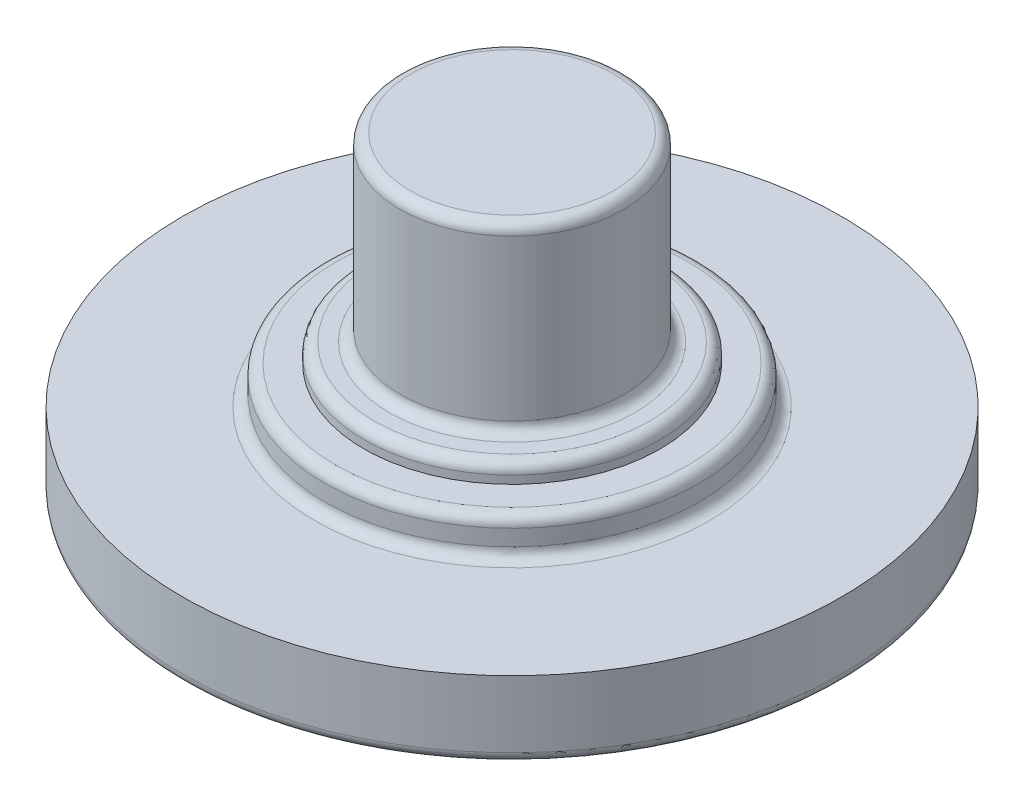
ISO-10303-21;
HEADER;
FILE_DESCRIPTION(('STEP AP214'),'2;1');
FILE_NAME('part.step','',(''),(''),'','','');
FILE_SCHEMA(('AUTOMOTIVE_DESIGN { 1 0 10303 214 1 1 1 1 }'));
ENDSEC;
DATA;
#1=APPLICATION_CONTEXT('core data for automotive mechanical design processes');
#2=APPLICATION_PROTOCOL_DEFINITION('international standard','automotive_design',2000,#1);
#3=PRODUCT_CONTEXT('',#1,'mechanical');
#4=PRODUCT('Part','Part','',(#3));
#5=PRODUCT_RELATED_PRODUCT_CATEGORY('part','',(#4));
#6=PRODUCT_DEFINITION_FORMATION('','',#4);
#7=PRODUCT_DEFINITION_CONTEXT('part definition',#1,'design');
#8=PRODUCT_DEFINITION('design','',#6,#7);
#9=PRODUCT_DEFINITION_SHAPE('','',#8);
#10=(LENGTH_UNIT() NAMED_UNIT(*) SI_UNIT(.MILLI.,.METRE.));
#11=(NAMED_UNIT(*) PLANE_ANGLE_UNIT() SI_UNIT($,.RADIAN.));
#12=(NAMED_UNIT(*) SI_UNIT($,.STERADIAN.) SOLID_ANGLE_UNIT());
#13=UNCERTAINTY_MEASURE_WITH_UNIT(LENGTH_MEASURE(1.E-05),#10,'distance_accuracy_value','');
#14=(GEOMETRIC_REPRESENTATION_CONTEXT(3) GLOBAL_UNCERTAINTY_ASSIGNED_CONTEXT((#13)) GLOBAL_UNIT_ASSIGNED_CONTEXT((#10,
#11,#12)) REPRESENTATION_CONTEXT('',''));
#15=CARTESIAN_POINT('',(0.,0.,0.));
#16=DIRECTION('',(0.,0.,1.));
#17=DIRECTION('',(1.,0.,0.));
#18=AXIS2_PLACEMENT_3D('',#15,#16,#17);
#19=CARTESIAN_POINT('',(0.,52.9542823974938,0.));
#20=DIRECTION('',(0.,-1.,0.));
#21=DIRECTION('',(1.,0.,0.));
#22=AXIS2_PLACEMENT_3D('',#19,#20,#21);
#23=PLANE('',#22);
#24=CARTESIAN_POINT('',(0.,52.9542823974938,0.));
#25=DIRECTION('',(0.,-1.,0.));
#26=DIRECTION('',(1.,0.,0.));
#27=AXIS2_PLACEMENT_3D('',#24,#25,#26);
#28=CIRCLE('',#27,19.);
#29=CARTESIAN_POINT('',(19.,52.9542823974938,0.));
#30=VERTEX_POINT('',#29);
#31=EDGE_CURVE('E102',#30,#30,#28,.F.);
#32=ORIENTED_EDGE('',*,*,#31,.T.);
#33=EDGE_LOOP('',(#32));
#34=FACE_BOUND('',#33,.T.);
#35=ADVANCED_FACE('F31',(#34),#23,.F.);
#36=CARTESIAN_POINT('',(0.,52.9542823974938,0.));
#37=DIRECTION('',(0.,1.,0.));
#38=DIRECTION('',(-1.,0.,0.));
#39=AXIS2_PLACEMENT_3D('',#36,#37,#38);
#40=CYLINDRICAL_SURFACE('',#39,21.);
#41=CARTESIAN_POINT('',(0.,20.9542823974938,0.));
#42=DIRECTION('',(0.,-1.,0.));
#43=DIRECTION('',(1.,0.,0.));
#44=AXIS2_PLACEMENT_3D('',#41,#42,#43);
#45=CIRCLE('',#44,21.);
#46=CARTESIAN_POINT('',(21.,20.9542823974938,0.));
#47=VERTEX_POINT('',#46);
#48=EDGE_CURVE('E87',#47,#47,#45,.F.);
#49=ORIENTED_EDGE('',*,*,#48,.T.);
#50=EDGE_LOOP('',(#49));
#51=FACE_BOUND('',#50,.T.);
#52=CARTESIAN_POINT('',(0.,50.9542823974938,0.));
#53=DIRECTION('',(0.,-1.,0.));
#54=DIRECTION('',(1.,0.,0.));
#55=AXIS2_PLACEMENT_3D('',#52,#53,#54);
#56=CIRCLE('',#55,21.);
#57=CARTESIAN_POINT('',(21.,50.9542823974938,0.));
#58=VERTEX_POINT('',#57);
#59=EDGE_CURVE('E99',#58,#58,#56,.T.);
#60=ORIENTED_EDGE('',*,*,#59,.T.);
#61=EDGE_LOOP('',(#60));
#62=FACE_BOUND('',#61,.T.);
#63=ADVANCED_FACE('F136',(#51,#62),#40,.T.);
#64=CARTESIAN_POINT('',(21.,18.9542823974938,0.));
#65=DIRECTION('',(0.,-1.,0.));
#66=DIRECTION('',(1.,0.,0.));
#67=AXIS2_PLACEMENT_3D('',#64,#65,#66);
#68=PLANE('',#67);
#69=CARTESIAN_POINT('',(0.,18.9542823974938,0.));
#70=DIRECTION('',(0.,-1.,0.));
#71=DIRECTION('',(1.,0.,0.));
#72=AXIS2_PLACEMENT_3D('',#69,#70,#71);
#73=CIRCLE('',#72,25.75);
#74=CARTESIAN_POINT('',(25.75,18.9542823974938,0.));
#75=VERTEX_POINT('',#74);
#76=EDGE_CURVE('E93',#75,#75,#73,.F.);
#77=ORIENTED_EDGE('',*,*,#76,.T.);
#78=EDGE_LOOP('',(#77));
#79=FACE_BOUND('',#78,.T.);
#80=CARTESIAN_POINT('',(0.,18.9542823974938,0.));
#81=DIRECTION('',(0.,-1.,0.));
#82=DIRECTION('',(1.,0.,0.));
#83=AXIS2_PLACEMENT_3D('',#80,#81,#82);
#84=CIRCLE('',#83,23.);
#85=CARTESIAN_POINT('',(23.,18.9542823974938,0.));
#86=VERTEX_POINT('',#85);
#87=EDGE_CURVE('E96',#86,#86,#84,.T.);
#88=ORIENTED_EDGE('',*,*,#87,.T.);
#89=EDGE_LOOP('',(#88));
#90=FACE_BOUND('',#89,.T.);
#91=ADVANCED_FACE('F142',(#79,#90),#68,.F.);
#92=CARTESIAN_POINT('',(0.,52.9542823974938,0.));
#93=DIRECTION('',(0.,1.,0.));
#94=DIRECTION('',(-1.,0.,0.));
#95=AXIS2_PLACEMENT_3D('',#92,#93,#94);
#96=CYLINDRICAL_SURFACE('',#95,27.75);
#97=CARTESIAN_POINT('',(0.,16.9542823974938,0.));
#98=DIRECTION('',(0.,-1.,0.));
#99=DIRECTION('',(1.,0.,0.));
#100=AXIS2_PLACEMENT_3D('',#97,#98,#99);
#101=CIRCLE('',#100,27.75);
#102=CARTESIAN_POINT('',(27.75,16.9542823974938,0.));
#103=VERTEX_POINT('',#102);
#104=EDGE_CURVE('E90',#103,#103,#101,.T.);
#105=ORIENTED_EDGE('',*,*,#104,.T.);
#106=EDGE_LOOP('',(#105));
#107=FACE_BOUND('',#106,.T.);
#108=CARTESIAN_POINT('',(0.,15.4542823974938,0.));
#109=DIRECTION('',(0.,1.,0.));
#110=DIRECTION('',(-1.,0.,0.));
#111=AXIS2_PLACEMENT_3D('',#108,#109,#110);
#112=CIRCLE('',#111,27.75);
#113=CARTESIAN_POINT('',(-27.75,15.4542823974938,0.));
#114=VERTEX_POINT('',#113);
#115=EDGE_CURVE('E105',#114,#114,#112,.T.);
#116=ORIENTED_EDGE('',*,*,#115,.T.);
#117=EDGE_LOOP('',(#116));
#118=FACE_BOUND('',#117,.T.);
#119=ADVANCED_FACE('F226',(#107,#118),#96,.T.);
#120=CARTESIAN_POINT('',(27.75,15.4542823974938,0.));
#121=DIRECTION('',(0.,-1.,0.));
#122=DIRECTION('',(1.,0.,0.));
#123=AXIS2_PLACEMENT_3D('',#120,#121,#122);
#124=PLANE('',#123);
#125=CARTESIAN_POINT('',(0.,15.4542823974938,0.));
#126=DIRECTION('',(0.,-1.,0.));
#127=DIRECTION('',(1.,0.,0.));
#128=AXIS2_PLACEMENT_3D('',#125,#126,#127);
#129=CIRCLE('',#128,33.);
#130=CARTESIAN_POINT('',(33.,15.4542823974938,0.));
#131=VERTEX_POINT('',#130);
#132=EDGE_CURVE('E69',#131,#131,#129,.F.);
#133=ORIENTED_EDGE('',*,*,#132,.T.);
#134=EDGE_LOOP('',(#133));
#135=FACE_BOUND('',#134,.T.);
#136=ORIENTED_EDGE('',*,*,#115,.F.);
#137=EDGE_LOOP('',(#136));
#138=FACE_BOUND('',#137,.T.);
#139=ADVANCED_FACE('F222',(#135,#138),#124,.F.);
#140=CARTESIAN_POINT('',(0.,52.9542823974938,0.));
#141=DIRECTION('',(0.,1.,0.));
#142=DIRECTION('',(-1.,0.,0.));
#143=AXIS2_PLACEMENT_3D('',#140,#141,#142);
#144=CYLINDRICAL_SURFACE('',#143,35.);
#145=CARTESIAN_POINT('',(0.,10.4542823974938,0.));
#146=DIRECTION('',(0.,-1.,0.));
#147=DIRECTION('',(1.,0.,0.));
#148=AXIS2_PLACEMENT_3D('',#145,#146,#147);
#149=CIRCLE('',#148,35.);
#150=CARTESIAN_POINT('',(35.,10.4542823974938,0.));
#151=VERTEX_POINT('',#150);
#152=EDGE_CURVE('E75',#151,#151,#149,.F.);
#153=ORIENTED_EDGE('',*,*,#152,.T.);
#154=EDGE_LOOP('',(#153));
#155=FACE_BOUND('',#154,.T.);
#156=CARTESIAN_POINT('',(0.,13.4542823974938,0.));
#157=DIRECTION('',(0.,-1.,0.));
#158=DIRECTION('',(1.,0.,0.));
#159=AXIS2_PLACEMENT_3D('',#156,#157,#158);
#160=CIRCLE('',#159,35.);
#161=CARTESIAN_POINT('',(35.,13.4542823974938,0.));
#162=VERTEX_POINT('',#161);
#163=EDGE_CURVE('E78',#162,#162,#160,.T.);
#164=ORIENTED_EDGE('',*,*,#163,.T.);
#165=EDGE_LOOP('',(#164));
#166=FACE_BOUND('',#165,.T.);
#167=ADVANCED_FACE('F218',(#155,#166),#144,.T.);
#168=CARTESIAN_POINT('',(35.,8.45428239749381,0.));
#169=DIRECTION('',(0.,-1.,0.));
#170=DIRECTION('',(1.,0.,0.));
#171=AXIS2_PLACEMENT_3D('',#168,#169,#170);
#172=PLANE('',#171);
#173=CARTESIAN_POINT('',(0.,8.45428239749381,0.));
#174=DIRECTION('',(0.,-1.,0.));
#175=DIRECTION('',(1.,0.,0.));
#176=AXIS2_PLACEMENT_3D('',#173,#174,#175);
#177=CIRCLE('',#176,37.);
#178=CARTESIAN_POINT('',(37.,8.45428239749381,0.));
#179=VERTEX_POINT('',#178);
#180=EDGE_CURVE('E72',#179,#179,#177,.T.);
#181=ORIENTED_EDGE('',*,*,#180,.T.);
#182=EDGE_LOOP('',(#181));
#183=FACE_BOUND('',#182,.T.);
#184=CARTESIAN_POINT('',(0.,8.45428239749381,0.));
#185=DIRECTION('',(0.,1.,0.));
#186=DIRECTION('',(-1.,0.,0.));
#187=AXIS2_PLACEMENT_3D('',#184,#185,#186);
#188=CIRCLE('',#187,61.75);
#189=CARTESIAN_POINT('',(-61.75,8.45428239749381,0.));
#190=VERTEX_POINT('',#189);
#191=EDGE_CURVE('E108',#190,#190,#188,.T.);
#192=ORIENTED_EDGE('',*,*,#191,.T.);
#193=EDGE_LOOP('',(#192));
#194=FACE_BOUND('',#193,.T.);
#195=ADVANCED_FACE('F214',(#183,#194),#172,.F.);
#196=CARTESIAN_POINT('',(0.,52.9542823974938,0.));
#197=DIRECTION('',(0.,1.,0.));
#198=DIRECTION('',(-1.,0.,0.));
#199=AXIS2_PLACEMENT_3D('',#196,#197,#198);
#200=CYLINDRICAL_SURFACE('',#199,61.75);
#201=CARTESIAN_POINT('',(0.,-4.04571760250619,0.));
#202=DIRECTION('',(0.,1.,0.));
#203=DIRECTION('',(-1.,0.,0.));
#204=AXIS2_PLACEMENT_3D('',#201,#202,#203);
#205=CIRCLE('',#204,61.75);
#206=CARTESIAN_POINT('',(-61.75,-4.04571760250619,0.));
#207=VERTEX_POINT('',#206);
#208=EDGE_CURVE('E84',#207,#207,#205,.T.);
#209=ORIENTED_EDGE('',*,*,#208,.T.);
#210=EDGE_LOOP('',(#209));
#211=FACE_BOUND('',#210,.T.);
#212=ORIENTED_EDGE('',*,*,#191,.F.);
#213=EDGE_LOOP('',(#212));
#214=FACE_BOUND('',#213,.T.);
#215=ADVANCED_FACE('F207',(#211,#214),#200,.T.);
#216=CARTESIAN_POINT('',(61.75,-6.0457176025062,0.));
#217=DIRECTION('',(0.,1.,0.));
#218=DIRECTION('',(-1.,0.,0.));
#219=AXIS2_PLACEMENT_3D('',#216,#217,#218);
#220=PLANE('',#219);
#221=CARTESIAN_POINT('',(0.,-6.04571760250619,0.));
#222=DIRECTION('',(0.,1.,0.));
#223=DIRECTION('',(-1.,0.,0.));
#224=AXIS2_PLACEMENT_3D('',#221,#222,#223);
#225=CIRCLE('',#224,36.);
#226=CARTESIAN_POINT('',(-36.,-6.04571760250619,0.));
#227=VERTEX_POINT('',#226);
#228=EDGE_CURVE('E66',#227,#227,#225,.T.);
#229=ORIENTED_EDGE('',*,*,#228,.T.);
#230=EDGE_LOOP('',(#229));
#231=FACE_BOUND('',#230,.T.);
#232=CARTESIAN_POINT('',(0.,-6.04571760250619,0.));
#233=DIRECTION('',(0.,1.,0.));
#234=DIRECTION('',(-1.,0.,0.));
#235=AXIS2_PLACEMENT_3D('',#232,#233,#234);
#236=CIRCLE('',#235,59.75);
#237=CARTESIAN_POINT('',(-59.75,-6.04571760250619,0.));
#238=VERTEX_POINT('',#237);
#239=EDGE_CURVE('E81',#238,#238,#236,.F.);
#240=ORIENTED_EDGE('',*,*,#239,.T.);
#241=EDGE_LOOP('',(#240));
#242=FACE_BOUND('',#241,.T.);
#243=ADVANCED_FACE('F201',(#231,#242),#220,.F.);
#244=CARTESIAN_POINT('',(0.,52.9542823974938,0.));
#245=DIRECTION('',(0.,1.,0.));
#246=DIRECTION('',(-1.,0.,0.));
#247=AXIS2_PLACEMENT_3D('',#244,#245,#246);
#248=CYLINDRICAL_SURFACE('',#247,34.);
#249=CARTESIAN_POINT('',(0.,-8.04571760250619,0.));
#250=DIRECTION('',(0.,1.,0.));
#251=DIRECTION('',(-1.,0.,0.));
#252=AXIS2_PLACEMENT_3D('',#249,#250,#251);
#253=CIRCLE('',#252,34.);
#254=CARTESIAN_POINT('',(-34.,-8.04571760250619,0.));
#255=VERTEX_POINT('',#254);
#256=EDGE_CURVE('E63',#255,#255,#253,.F.);
#257=ORIENTED_EDGE('',*,*,#256,.T.);
#258=EDGE_LOOP('',(#257));
#259=FACE_BOUND('',#258,.T.);
#260=CARTESIAN_POINT('',(0.,-11.7457176025062,0.));
#261=DIRECTION('',(0.,1.,0.));
#262=DIRECTION('',(-1.,0.,0.));
#263=AXIS2_PLACEMENT_3D('',#260,#261,#262);
#264=CIRCLE('',#263,34.);
#265=CARTESIAN_POINT('',(-34.,-11.7457176025062,0.));
#266=VERTEX_POINT('',#265);
#267=EDGE_CURVE('E111',#266,#266,#264,.T.);
#268=ORIENTED_EDGE('',*,*,#267,.T.);
#269=EDGE_LOOP('',(#268));
#270=FACE_BOUND('',#269,.T.);
#271=ADVANCED_FACE('F196',(#259,#270),#248,.T.);
#272=CARTESIAN_POINT('',(34.,-11.7457176025062,0.));
#273=DIRECTION('',(0.,1.,0.));
#274=DIRECTION('',(-1.,0.,0.));
#275=AXIS2_PLACEMENT_3D('',#272,#273,#274);
#276=PLANE('',#275);
#277=CARTESIAN_POINT('',(0.,-11.7457176025062,0.));
#278=DIRECTION('',(0.,1.,0.));
#279=DIRECTION('',(-1.,0.,0.));
#280=AXIS2_PLACEMENT_3D('',#277,#278,#279);
#281=CIRCLE('',#280,33.);
#282=CARTESIAN_POINT('',(-33.,-11.7457176025062,0.));
#283=VERTEX_POINT('',#282);
#284=EDGE_CURVE('E46',#283,#283,#281,.T.);
#285=ORIENTED_EDGE('',*,*,#284,.T.);
#286=EDGE_LOOP('',(#285));
#287=FACE_BOUND('',#286,.T.);
#288=ORIENTED_EDGE('',*,*,#267,.F.);
#289=EDGE_LOOP('',(#288));
#290=FACE_BOUND('',#289,.T.);
#291=ADVANCED_FACE('F192',(#287,#290),#276,.F.);
#292=CARTESIAN_POINT('',(0.,52.9542823974938,0.));
#293=DIRECTION('',(0.,1.,0.));
#294=DIRECTION('',(-1.,0.,0.));
#295=AXIS2_PLACEMENT_3D('',#292,#293,#294);
#296=CYLINDRICAL_SURFACE('',#295,30.);
#297=CARTESIAN_POINT('',(0.,-26.0457176025062,0.));
#298=DIRECTION('',(0.,1.,0.));
#299=DIRECTION('',(-1.,0.,0.));
#300=AXIS2_PLACEMENT_3D('',#297,#298,#299);
#301=CIRCLE('',#300,30.);
#302=CARTESIAN_POINT('',(-30.,-26.0457176025062,0.));
#303=VERTEX_POINT('',#302);
#304=EDGE_CURVE('E38',#303,#303,#301,.T.);
#305=ORIENTED_EDGE('',*,*,#304,.T.);
#306=EDGE_LOOP('',(#305));
#307=FACE_BOUND('',#306,.T.);
#308=CARTESIAN_POINT('',(0.,-14.7457176025062,0.));
#309=DIRECTION('',(0.,1.,0.));
#310=DIRECTION('',(-1.,0.,0.));
#311=AXIS2_PLACEMENT_3D('',#308,#309,#310);
#312=CIRCLE('',#311,30.);
#313=CARTESIAN_POINT('',(-30.,-14.7457176025062,0.));
#314=VERTEX_POINT('',#313);
#315=EDGE_CURVE('E42',#314,#314,#312,.F.);
#316=ORIENTED_EDGE('',*,*,#315,.T.);
#317=EDGE_LOOP('',(#316));
#318=FACE_BOUND('',#317,.T.);
#319=ADVANCED_FACE('F195',(#307,#318),#296,.T.);
#320=CARTESIAN_POINT('',(30.,-26.5457176025062,0.));
#321=DIRECTION('',(0.,1.,0.));
#322=DIRECTION('',(-1.,0.,0.));
#323=AXIS2_PLACEMENT_3D('',#320,#321,#322);
#324=PLANE('',#323);
#325=CARTESIAN_POINT('',(0.,-26.5457176025062,0.));
#326=DIRECTION('',(0.,1.,0.));
#327=DIRECTION('',(-1.,0.,0.));
#328=AXIS2_PLACEMENT_3D('',#325,#326,#327);
#329=CIRCLE('',#328,29.5);
#330=CARTESIAN_POINT('',(-29.5,-26.5457176025062,0.));
#331=VERTEX_POINT('',#330);
#332=EDGE_CURVE('E10',#331,#331,#329,.F.);
#333=ORIENTED_EDGE('',*,*,#332,.T.);
#334=EDGE_LOOP('',(#333));
#335=FACE_BOUND('',#334,.T.);
#336=CARTESIAN_POINT('',(0.,-26.5457176025062,0.));
#337=DIRECTION('',(0.,1.,0.));
#338=DIRECTION('',(-1.,0.,0.));
#339=AXIS2_PLACEMENT_3D('',#336,#337,#338);
#340=CIRCLE('',#339,26.);
#341=CARTESIAN_POINT('',(-26.,-26.5457176025062,0.));
#342=VERTEX_POINT('',#341);
#343=EDGE_CURVE('E54',#342,#342,#340,.T.);
#344=ORIENTED_EDGE('',*,*,#343,.T.);
#345=EDGE_LOOP('',(#344));
#346=FACE_BOUND('',#345,.T.);
#347=ADVANCED_FACE('F132',(#335,#346),#324,.F.);
#348=CARTESIAN_POINT('',(0.,52.9542823974938,0.));
#349=DIRECTION('',(0.,1.,0.));
#350=DIRECTION('',(-1.,0.,0.));
#351=AXIS2_PLACEMENT_3D('',#348,#349,#350);
#352=CYLINDRICAL_SURFACE('',#351,23.);
#353=CARTESIAN_POINT('',(0.,-23.5457176025062,0.));
#354=DIRECTION('',(0.,1.,0.));
#355=DIRECTION('',(-1.,0.,0.));
#356=AXIS2_PLACEMENT_3D('',#353,#354,#355);
#357=CIRCLE('',#356,23.);
#358=CARTESIAN_POINT('',(-23.,-23.5457176025062,0.));
#359=VERTEX_POINT('',#358);
#360=EDGE_CURVE('E51',#359,#359,#357,.F.);
#361=ORIENTED_EDGE('',*,*,#360,.T.);
#362=EDGE_LOOP('',(#361));
#363=FACE_BOUND('',#362,.T.);
#364=CARTESIAN_POINT('',(0.,-22.5457176025062,0.));
#365=DIRECTION('',(0.,1.,0.));
#366=DIRECTION('',(-1.,0.,0.));
#367=AXIS2_PLACEMENT_3D('',#364,#365,#366);
#368=CIRCLE('',#367,23.);
#369=CARTESIAN_POINT('',(-23.,-22.5457176025062,0.));
#370=VERTEX_POINT('',#369);
#371=EDGE_CURVE('E114',#370,#370,#368,.T.);
#372=ORIENTED_EDGE('',*,*,#371,.T.);
#373=EDGE_LOOP('',(#372));
#374=FACE_BOUND('',#373,.T.);
#375=ADVANCED_FACE('F118',(#363,#374),#352,.F.);
#376=CARTESIAN_POINT('',(0.,-9.04571760250621,0.));
#377=DIRECTION('',(0.,-1.,0.));
#378=DIRECTION('',(1.,0.,0.));
#379=AXIS2_PLACEMENT_3D('',#376,#377,#378);
#380=CONICAL_SURFACE('',#379,19.6340719616172,0.2443460952792);
#381=CARTESIAN_POINT('',(0.,-11.3199519157072,0.));
#382=DIRECTION('',(0.,-1.,0.));
#383=DIRECTION('',(1.,0.,0.));
#384=AXIS2_PLACEMENT_3D('',#381,#382,#383);
#385=CIRCLE('',#384,20.201102260925);
#386=CARTESIAN_POINT('',(20.201102260925,-11.3199519157072,0.));
#387=VERTEX_POINT('',#386);
#388=EDGE_CURVE('E60',#387,#387,#385,.F.);
#389=ORIENTED_EDGE('',*,*,#388,.T.);
#390=EDGE_LOOP('',(#389));
#391=FACE_BOUND('',#390,.T.);
#392=ORIENTED_EDGE('',*,*,#371,.F.);
#393=EDGE_LOOP('',(#392));
#394=FACE_BOUND('',#393,.T.);
#395=ADVANCED_FACE('F120',(#391,#394),#380,.F.);
#396=CARTESIAN_POINT('',(19.6340719616172,-9.04571760250621,0.));
#397=DIRECTION('',(0.,1.,0.));
#398=DIRECTION('',(-1.,0.,0.));
#399=AXIS2_PLACEMENT_3D('',#396,#397,#398);
#400=PLANE('',#399);
#401=CARTESIAN_POINT('',(0.,-9.04571760250621,0.));
#402=DIRECTION('',(0.,1.,0.));
#403=DIRECTION('',(-1.,0.,0.));
#404=AXIS2_PLACEMENT_3D('',#401,#402,#403);
#405=CIRCLE('',#404,17.290215082097);
#406=CARTESIAN_POINT('',(-17.290215082097,-9.04571760250621,0.));
#407=VERTEX_POINT('',#406);
#408=EDGE_CURVE('E57',#407,#407,#405,.F.);
#409=ORIENTED_EDGE('',*,*,#408,.T.);
#410=EDGE_LOOP('',(#409));
#411=FACE_BOUND('',#410,.T.);
#412=ADVANCED_FACE('F122',(#411),#400,.F.);
#413=CARTESIAN_POINT('',(0.,50.9542823974938,0.));
#414=DIRECTION('',(0.,-1.,0.));
#415=DIRECTION('',(1.,0.,0.));
#416=AXIS2_PLACEMENT_3D('',#413,#414,#415);
#417=TOROIDAL_SURFACE('',#416,19.,2.);
#418=ORIENTED_EDGE('',*,*,#59,.F.);
#419=EDGE_LOOP('',(#418));
#420=FACE_BOUND('',#419,.T.);
#421=ORIENTED_EDGE('',*,*,#31,.F.);
#422=EDGE_LOOP('',(#421));
#423=FACE_BOUND('',#422,.T.);
#424=ADVANCED_FACE('F129',(#420,#423),#417,.T.);
#425=CARTESIAN_POINT('',(0.,16.9542823974938,0.));
#426=DIRECTION('',(0.,-1.,0.));
#427=DIRECTION('',(1.,0.,0.));
#428=AXIS2_PLACEMENT_3D('',#425,#426,#427);
#429=TOROIDAL_SURFACE('',#428,25.75,2.);
#430=ORIENTED_EDGE('',*,*,#104,.F.);
#431=EDGE_LOOP('',(#430));
#432=FACE_BOUND('',#431,.T.);
#433=ORIENTED_EDGE('',*,*,#76,.F.);
#434=EDGE_LOOP('',(#433));
#435=FACE_BOUND('',#434,.T.);
#436=ADVANCED_FACE('F149',(#432,#435),#429,.T.);
#437=CARTESIAN_POINT('',(0.,20.9542823974938,0.));
#438=DIRECTION('',(0.,-1.,0.));
#439=DIRECTION('',(1.,0.,0.));
#440=AXIS2_PLACEMENT_3D('',#437,#438,#439);
#441=TOROIDAL_SURFACE('',#440,23.,2.);
#442=ORIENTED_EDGE('',*,*,#87,.F.);
#443=EDGE_LOOP('',(#442));
#444=FACE_BOUND('',#443,.T.);
#445=ORIENTED_EDGE('',*,*,#48,.F.);
#446=EDGE_LOOP('',(#445));
#447=FACE_BOUND('',#446,.T.);
#448=ADVANCED_FACE('F153',(#444,#447),#441,.F.);
#449=CARTESIAN_POINT('',(0.,-4.04571760250619,0.));
#450=DIRECTION('',(0.,1.,0.));
#451=DIRECTION('',(-1.,0.,0.));
#452=AXIS2_PLACEMENT_3D('',#449,#450,#451);
#453=TOROIDAL_SURFACE('',#452,59.75,2.);
#454=ORIENTED_EDGE('',*,*,#239,.F.);
#455=EDGE_LOOP('',(#454));
#456=FACE_BOUND('',#455,.T.);
#457=ORIENTED_EDGE('',*,*,#208,.F.);
#458=EDGE_LOOP('',(#457));
#459=FACE_BOUND('',#458,.T.);
#460=ADVANCED_FACE('F157',(#456,#459),#453,.T.);
#461=CARTESIAN_POINT('',(0.,10.4542823974938,0.));
#462=DIRECTION('',(0.,-1.,0.));
#463=DIRECTION('',(1.,0.,0.));
#464=AXIS2_PLACEMENT_3D('',#461,#462,#463);
#465=TOROIDAL_SURFACE('',#464,37.,2.);
#466=ORIENTED_EDGE('',*,*,#180,.F.);
#467=EDGE_LOOP('',(#466));
#468=FACE_BOUND('',#467,.T.);
#469=ORIENTED_EDGE('',*,*,#152,.F.);
#470=EDGE_LOOP('',(#469));
#471=FACE_BOUND('',#470,.T.);
#472=ADVANCED_FACE('F161',(#468,#471),#465,.F.);
#473=CARTESIAN_POINT('',(0.,13.4542823974938,0.));
#474=DIRECTION('',(0.,-1.,0.));
#475=DIRECTION('',(1.,0.,0.));
#476=AXIS2_PLACEMENT_3D('',#473,#474,#475);
#477=TOROIDAL_SURFACE('',#476,33.,2.);
#478=ORIENTED_EDGE('',*,*,#163,.F.);
#479=EDGE_LOOP('',(#478));
#480=FACE_BOUND('',#479,.T.);
#481=ORIENTED_EDGE('',*,*,#132,.F.);
#482=EDGE_LOOP('',(#481));
#483=FACE_BOUND('',#482,.T.);
#484=ADVANCED_FACE('F165',(#480,#483),#477,.T.);
#485=CARTESIAN_POINT('',(0.,-8.04571760250619,0.));
#486=DIRECTION('',(0.,1.,0.));
#487=DIRECTION('',(-1.,0.,0.));
#488=AXIS2_PLACEMENT_3D('',#485,#486,#487);
#489=TOROIDAL_SURFACE('',#488,36.,2.);
#490=ORIENTED_EDGE('',*,*,#256,.F.);
#491=EDGE_LOOP('',(#490));
#492=FACE_BOUND('',#491,.T.);
#493=ORIENTED_EDGE('',*,*,#228,.F.);
#494=EDGE_LOOP('',(#493));
#495=FACE_BOUND('',#494,.T.);
#496=ADVANCED_FACE('F169',(#492,#495),#489,.F.);
#497=CARTESIAN_POINT('',(0.,-12.0457176025062,0.));
#498=DIRECTION('',(0.,1.,0.));
#499=DIRECTION('',(-1.,0.,0.));
#500=AXIS2_PLACEMENT_3D('',#497,#498,#499);
#501=TOROIDAL_SURFACE('',#500,17.290215082097,3.);
#502=ORIENTED_EDGE('',*,*,#408,.F.);
#503=EDGE_LOOP('',(#502));
#504=FACE_BOUND('',#503,.T.);
#505=ORIENTED_EDGE('',*,*,#388,.F.);
#506=EDGE_LOOP('',(#505));
#507=FACE_BOUND('',#506,.T.);
#508=ADVANCED_FACE('F173',(#504,#507),#501,.F.);
#509=CARTESIAN_POINT('',(0.,-23.5457176025062,0.));
#510=DIRECTION('',(0.,1.,0.));
#511=DIRECTION('',(-1.,0.,0.));
#512=AXIS2_PLACEMENT_3D('',#509,#510,#511);
#513=TOROIDAL_SURFACE('',#512,26.,3.);
#514=ORIENTED_EDGE('',*,*,#360,.F.);
#515=EDGE_LOOP('',(#514));
#516=FACE_BOUND('',#515,.T.);
#517=ORIENTED_EDGE('',*,*,#343,.F.);
#518=EDGE_LOOP('',(#517));
#519=FACE_BOUND('',#518,.T.);
#520=ADVANCED_FACE('F177',(#516,#519),#513,.T.);
#521=CARTESIAN_POINT('',(0.,-14.7457176025062,0.));
#522=DIRECTION('',(0.,1.,0.));
#523=DIRECTION('',(-1.,0.,0.));
#524=AXIS2_PLACEMENT_3D('',#521,#522,#523);
#525=TOROIDAL_SURFACE('',#524,33.,3.);
#526=ORIENTED_EDGE('',*,*,#315,.F.);
#527=EDGE_LOOP('',(#526));
#528=FACE_BOUND('',#527,.T.);
#529=ORIENTED_EDGE('',*,*,#284,.F.);
#530=EDGE_LOOP('',(#529));
#531=FACE_BOUND('',#530,.T.);
#532=ADVANCED_FACE('F180',(#528,#531),#525,.F.);
#533=CARTESIAN_POINT('',(0.,-26.0457176025062,0.));
#534=DIRECTION('',(0.,1.,0.));
#535=DIRECTION('',(-1.,0.,0.));
#536=AXIS2_PLACEMENT_3D('',#533,#534,#535);
#537=TOROIDAL_SURFACE('',#536,29.5,0.5);
#538=ORIENTED_EDGE('',*,*,#332,.F.);
#539=EDGE_LOOP('',(#538));
#540=FACE_BOUND('',#539,.T.);
#541=ORIENTED_EDGE('',*,*,#304,.F.);
#542=EDGE_LOOP('',(#541));
#543=FACE_BOUND('',#542,.T.);
#544=ADVANCED_FACE('F33',(#540,#543),#537,.T.);
#545=CLOSED_SHELL('',(#35,#63,#91,#119,#139,#167,#195,#215,#243,#271,#291,#319,#347,#375,#395,
#412,#424,#436,#448,#460,#472,#484,#496,#508,#520,#532,#544));
#546=MANIFOLD_SOLID_BREP('B2',#545);
#547=ADVANCED_BREP_SHAPE_REPRESENTATION('',(#18,#546),#14);
#548=SHAPE_DEFINITION_REPRESENTATION(#9,#547);
ENDSEC;
END-ISO-10303-21;
